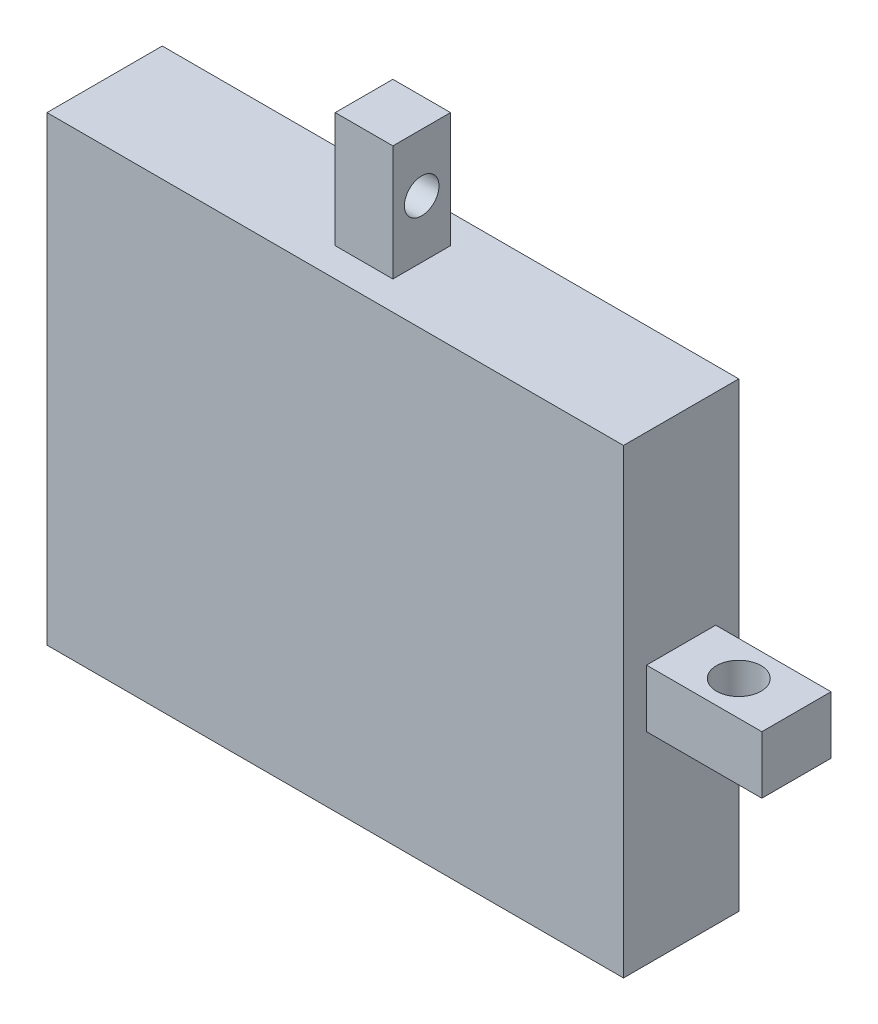
ISO-10303-21;
HEADER;
FILE_DESCRIPTION(('STEP AP214'),'2;1');
FILE_NAME('part.step','',(''),(''),'','','');
FILE_SCHEMA(('AUTOMOTIVE_DESIGN { 1 0 10303 214 1 1 1 1 }'));
ENDSEC;
DATA;
#1=APPLICATION_CONTEXT('core data for automotive mechanical design processes');
#2=APPLICATION_PROTOCOL_DEFINITION('international standard','automotive_design',2000,#1);
#3=PRODUCT_CONTEXT('',#1,'mechanical');
#4=PRODUCT('Part','Part','',(#3));
#5=PRODUCT_RELATED_PRODUCT_CATEGORY('part','',(#4));
#6=PRODUCT_DEFINITION_FORMATION('','',#4);
#7=PRODUCT_DEFINITION_CONTEXT('part definition',#1,'design');
#8=PRODUCT_DEFINITION('design','',#6,#7);
#9=PRODUCT_DEFINITION_SHAPE('','',#8);
#10=(LENGTH_UNIT() NAMED_UNIT(*) SI_UNIT(.MILLI.,.METRE.));
#11=(NAMED_UNIT(*) PLANE_ANGLE_UNIT() SI_UNIT($,.RADIAN.));
#12=(NAMED_UNIT(*) SI_UNIT($,.STERADIAN.) SOLID_ANGLE_UNIT());
#13=UNCERTAINTY_MEASURE_WITH_UNIT(LENGTH_MEASURE(1.E-05),#10,'distance_accuracy_value','');
#14=(GEOMETRIC_REPRESENTATION_CONTEXT(3) GLOBAL_UNCERTAINTY_ASSIGNED_CONTEXT((#13)) GLOBAL_UNIT_ASSIGNED_CONTEXT((#10,
#11,#12)) REPRESENTATION_CONTEXT('',''));
#15=CARTESIAN_POINT('',(0.,0.,0.));
#16=DIRECTION('',(0.,0.,1.));
#17=DIRECTION('',(1.,0.,0.));
#18=AXIS2_PLACEMENT_3D('',#15,#16,#17);
#19=CARTESIAN_POINT('',(-26.4685029579254,457.637931034483,10.));
#20=DIRECTION('',(0.,-1.,0.));
#21=DIRECTION('',(0.,0.,-1.));
#22=AXIS2_PLACEMENT_3D('',#19,#20,#21);
#23=PLANE('',#22);
#24=DIRECTION('',(-1.,0.,0.));
#25=VECTOR('',#24,1.);
#26=CARTESIAN_POINT('',(-26.4685029579254,457.637931034483,0.));
#27=LINE('',#26,#25);
#28=CARTESIAN_POINT('',(23.5314970420778,457.637931034483,0.));
#29=VERTEX_POINT('',#28);
#30=CARTESIAN_POINT('',(-26.4685029579285,457.637931034483,0.));
#31=VERTEX_POINT('',#30);
#32=EDGE_CURVE('E234',#29,#31,#27,.T.);
#33=ORIENTED_EDGE('',*,*,#32,.T.);
#34=DIRECTION('',(0.,0.,-1.));
#35=VECTOR('',#34,1.);
#36=CARTESIAN_POINT('',(-26.4685029579285,457.637931034483,10.));
#37=LINE('',#36,#35);
#38=CARTESIAN_POINT('',(-26.4685029579285,457.637931034483,10.));
#39=VERTEX_POINT('',#38);
#40=EDGE_CURVE('E173',#39,#31,#37,.T.);
#41=ORIENTED_EDGE('',*,*,#40,.F.);
#42=DIRECTION('',(-1.,0.,0.));
#43=VECTOR('',#42,1.);
#44=CARTESIAN_POINT('',(-26.4685029579254,457.637931034483,10.));
#45=LINE('',#44,#43);
#46=CARTESIAN_POINT('',(23.5314970420778,457.637931034483,10.));
#47=VERTEX_POINT('',#46);
#48=EDGE_CURVE('E237',#47,#39,#45,.T.);
#49=ORIENTED_EDGE('',*,*,#48,.F.);
#50=DIRECTION('',(0.,0.,-1.));
#51=VECTOR('',#50,1.);
#52=CARTESIAN_POINT('',(23.5314970420778,457.637931034483,10.));
#53=LINE('',#52,#51);
#54=EDGE_CURVE('E50',#47,#29,#53,.T.);
#55=ORIENTED_EDGE('',*,*,#54,.T.);
#56=EDGE_LOOP('',(#33,#41,#49,#55));
#57=FACE_BOUND('',#56,.T.);
#58=DIRECTION('',(0.,0.,1.));
#59=VECTOR('',#58,1.);
#60=CARTESIAN_POINT('',(-3.96850295792851,457.637931034483,2.5));
#61=LINE('',#60,#59);
#62=CARTESIAN_POINT('',(-3.96850295792851,457.637931034483,2.5));
#63=VERTEX_POINT('',#62);
#64=CARTESIAN_POINT('',(-3.96850295792851,457.637931034483,7.5));
#65=VERTEX_POINT('',#64);
#66=EDGE_CURVE('E153',#63,#65,#61,.T.);
#67=ORIENTED_EDGE('',*,*,#66,.F.);
#68=DIRECTION('',(-1.,0.,0.));
#69=VECTOR('',#68,1.);
#70=CARTESIAN_POINT('',(-3.96850295792851,457.637931034483,2.5));
#71=LINE('',#70,#69);
#72=CARTESIAN_POINT('',(1.0314970420778,457.637931034483,2.5));
#73=VERTEX_POINT('',#72);
#74=EDGE_CURVE('E150',#73,#63,#71,.T.);
#75=ORIENTED_EDGE('',*,*,#74,.F.);
#76=DIRECTION('',(0.,0.,-1.));
#77=VECTOR('',#76,1.);
#78=CARTESIAN_POINT('',(1.0314970420778,457.637931034483,2.5));
#79=LINE('',#78,#77);
#80=CARTESIAN_POINT('',(1.0314970420778,457.637931034483,7.5));
#81=VERTEX_POINT('',#80);
#82=EDGE_CURVE('E62',#81,#73,#79,.T.);
#83=ORIENTED_EDGE('',*,*,#82,.F.);
#84=DIRECTION('',(1.,0.,0.));
#85=VECTOR('',#84,1.);
#86=CARTESIAN_POINT('',(-3.96850295792851,457.637931034483,7.5));
#87=LINE('',#86,#85);
#88=EDGE_CURVE('E57',#65,#81,#87,.T.);
#89=ORIENTED_EDGE('',*,*,#88,.F.);
#90=EDGE_LOOP('',(#67,#75,#83,#89));
#91=FACE_BOUND('',#90,.T.);
#92=ADVANCED_FACE('F41',(#57,#91),#23,.F.);
#93=CARTESIAN_POINT('',(33.5314970420422,-2.60708386863427E-12,2.));
#94=DIRECTION('',(0.,0.,-1.));
#95=DIRECTION('',(-1.,0.,0.));
#96=AXIS2_PLACEMENT_3D('',#93,#94,#95);
#97=PLANE('',#96);
#98=DIRECTION('',(0.,-1.,0.));
#99=VECTOR('',#98,1.);
#100=CARTESIAN_POINT('',(23.5314970420422,-1.82992775139664E-12,2.));
#101=LINE('',#100,#99);
#102=CARTESIAN_POINT('',(23.5314970420747,440.137931034485,2.));
#103=VERTEX_POINT('',#102);
#104=CARTESIAN_POINT('',(23.5314970420747,435.137931034485,2.));
#105=VERTEX_POINT('',#104);
#106=EDGE_CURVE('E210',#103,#105,#101,.T.);
#107=ORIENTED_EDGE('',*,*,#106,.F.);
#108=DIRECTION('',(1.,0.,0.));
#109=VECTOR('',#108,1.);
#110=CARTESIAN_POINT('',(33.5314970420422,440.137931034485,2.));
#111=LINE('',#110,#109);
#112=CARTESIAN_POINT('',(33.5314970420768,440.137931034485,2.));
#113=VERTEX_POINT('',#112);
#114=EDGE_CURVE('E201',#103,#113,#111,.T.);
#115=ORIENTED_EDGE('',*,*,#114,.T.);
#116=DIRECTION('',(0.,-1.,0.));
#117=VECTOR('',#116,1.);
#118=CARTESIAN_POINT('',(33.5314970420422,-2.60708386863427E-12,2.));
#119=LINE('',#118,#117);
#120=CARTESIAN_POINT('',(33.5314970420757,435.137931034485,2.));
#121=VERTEX_POINT('',#120);
#122=EDGE_CURVE('E214',#113,#121,#119,.T.);
#123=ORIENTED_EDGE('',*,*,#122,.T.);
#124=DIRECTION('',(1.,0.,0.));
#125=VECTOR('',#124,1.);
#126=CARTESIAN_POINT('',(33.5314970420422,435.137931034485,2.));
#127=LINE('',#126,#125);
#128=EDGE_CURVE('E190',#105,#121,#127,.T.);
#129=ORIENTED_EDGE('',*,*,#128,.F.);
#130=EDGE_LOOP('',(#107,#115,#123,#129));
#131=FACE_BOUND('',#130,.T.);
#132=ADVANCED_FACE('F277',(#131),#97,.T.);
#133=CARTESIAN_POINT('',(33.5314970420422,-2.60708386863427E-12,8.));
#134=DIRECTION('',(0.,0.,-1.));
#135=DIRECTION('',(-1.,0.,0.));
#136=AXIS2_PLACEMENT_3D('',#133,#134,#135);
#137=PLANE('',#136);
#138=DIRECTION('',(-1.,0.,0.));
#139=VECTOR('',#138,1.);
#140=CARTESIAN_POINT('',(33.5314970420768,440.137931034485,8.));
#141=LINE('',#140,#139);
#142=CARTESIAN_POINT('',(33.5314970420764,440.137931034485,8.));
#143=VERTEX_POINT('',#142);
#144=CARTESIAN_POINT('',(23.5314970420747,440.137931034485,8.));
#145=VERTEX_POINT('',#144);
#146=EDGE_CURVE('E178',#143,#145,#141,.T.);
#147=ORIENTED_EDGE('',*,*,#146,.T.);
#148=DIRECTION('',(0.,-1.,0.));
#149=VECTOR('',#148,1.);
#150=CARTESIAN_POINT('',(23.5314970420422,-1.82992775139664E-12,8.));
#151=LINE('',#150,#149);
#152=CARTESIAN_POINT('',(23.5314970420747,435.137931034485,8.));
#153=VERTEX_POINT('',#152);
#154=EDGE_CURVE('E219',#145,#153,#151,.T.);
#155=ORIENTED_EDGE('',*,*,#154,.T.);
#156=DIRECTION('',(-1.,0.,0.));
#157=VECTOR('',#156,1.);
#158=CARTESIAN_POINT('',(33.5314970420757,435.137931034485,8.));
#159=LINE('',#158,#157);
#160=CARTESIAN_POINT('',(33.5314970420757,435.137931034485,8.));
#161=VERTEX_POINT('',#160);
#162=EDGE_CURVE('E183',#161,#153,#159,.T.);
#163=ORIENTED_EDGE('',*,*,#162,.F.);
#164=DIRECTION('',(0.,-1.,0.));
#165=VECTOR('',#164,1.);
#166=CARTESIAN_POINT('',(33.5314970420422,-2.60708386863427E-12,8.));
#167=LINE('',#166,#165);
#168=EDGE_CURVE('E218',#143,#161,#167,.T.);
#169=ORIENTED_EDGE('',*,*,#168,.F.);
#170=EDGE_LOOP('',(#147,#155,#163,#169));
#171=FACE_BOUND('',#170,.T.);
#172=ADVANCED_FACE('F284',(#171),#137,.F.);
#173=CARTESIAN_POINT('',(33.5314970420422,-2.60708386863427E-12,0.));
#174=DIRECTION('',(1.,0.,0.));
#175=DIRECTION('',(0.,1.,0.));
#176=AXIS2_PLACEMENT_3D('',#173,#174,#175);
#177=PLANE('',#176);
#178=ORIENTED_EDGE('',*,*,#122,.F.);
#179=DIRECTION('',(0.,0.,1.));
#180=VECTOR('',#179,1.);
#181=CARTESIAN_POINT('',(33.5314970420768,440.137931034485,-7.));
#182=LINE('',#181,#180);
#183=EDGE_CURVE('E182',#113,#143,#182,.T.);
#184=ORIENTED_EDGE('',*,*,#183,.T.);
#185=ORIENTED_EDGE('',*,*,#168,.T.);
#186=DIRECTION('',(0.,0.,1.));
#187=VECTOR('',#186,1.);
#188=CARTESIAN_POINT('',(33.5314970420757,435.137931034485,-7.));
#189=LINE('',#188,#187);
#190=EDGE_CURVE('E177',#121,#161,#189,.T.);
#191=ORIENTED_EDGE('',*,*,#190,.F.);
#192=EDGE_LOOP('',(#178,#184,#185,#191));
#193=FACE_BOUND('',#192,.T.);
#194=ADVANCED_FACE('F275',(#193),#177,.T.);
#195=CARTESIAN_POINT('',(23.5314970420778,457.637931034483,10.));
#196=DIRECTION('',(-1.,0.,0.));
#197=DIRECTION('',(0.,-1.,0.));
#198=AXIS2_PLACEMENT_3D('',#195,#196,#197);
#199=PLANE('',#198);
#200=DIRECTION('',(0.,1.,0.));
#201=VECTOR('',#200,1.);
#202=CARTESIAN_POINT('',(23.5314970420778,457.637931034483,0.));
#203=LINE('',#202,#201);
#204=CARTESIAN_POINT('',(23.5314970420747,417.637931034484,0.));
#205=VERTEX_POINT('',#204);
#206=EDGE_CURVE('E242',#205,#29,#203,.T.);
#207=ORIENTED_EDGE('',*,*,#206,.T.);
#208=ORIENTED_EDGE('',*,*,#54,.F.);
#209=DIRECTION('',(0.,1.,0.));
#210=VECTOR('',#209,1.);
#211=CARTESIAN_POINT('',(23.5314970420778,457.637931034483,10.));
#212=LINE('',#211,#210);
#213=CARTESIAN_POINT('',(23.5314970420747,417.637931034484,10.));
#214=VERTEX_POINT('',#213);
#215=EDGE_CURVE('E233',#214,#47,#212,.T.);
#216=ORIENTED_EDGE('',*,*,#215,.F.);
#217=DIRECTION('',(0.,0.,-1.));
#218=VECTOR('',#217,1.);
#219=CARTESIAN_POINT('',(23.5314970420747,417.637931034484,10.));
#220=LINE('',#219,#218);
#221=EDGE_CURVE('E11',#214,#205,#220,.T.);
#222=ORIENTED_EDGE('',*,*,#221,.T.);
#223=EDGE_LOOP('',(#207,#208,#216,#222));
#224=FACE_BOUND('',#223,.T.);
#225=DIRECTION('',(0.,0.,1.));
#226=VECTOR('',#225,1.);
#227=CARTESIAN_POINT('',(23.5314970420747,440.137931034485,-7.));
#228=LINE('',#227,#226);
#229=EDGE_CURVE('E187',#103,#145,#228,.T.);
#230=ORIENTED_EDGE('',*,*,#229,.F.);
#231=ORIENTED_EDGE('',*,*,#106,.T.);
#232=DIRECTION('',(0.,0.,1.));
#233=VECTOR('',#232,1.);
#234=CARTESIAN_POINT('',(23.5314970420747,435.137931034485,-7.));
#235=LINE('',#234,#233);
#236=EDGE_CURVE('E191',#105,#153,#235,.T.);
#237=ORIENTED_EDGE('',*,*,#236,.T.);
#238=ORIENTED_EDGE('',*,*,#154,.F.);
#239=EDGE_LOOP('',(#230,#231,#237,#238));
#240=FACE_BOUND('',#239,.T.);
#241=ADVANCED_FACE('F266',(#224,#240),#199,.F.);
#242=CARTESIAN_POINT('',(-26.4685029579254,417.637931034484,10.));
#243=DIRECTION('',(0.,1.,0.));
#244=DIRECTION('',(0.,0.,1.));
#245=AXIS2_PLACEMENT_3D('',#242,#243,#244);
#246=PLANE('',#245);
#247=DIRECTION('',(1.,0.,0.));
#248=VECTOR('',#247,1.);
#249=CARTESIAN_POINT('',(-26.4685029579254,417.637931034484,10.));
#250=LINE('',#249,#248);
#251=CARTESIAN_POINT('',(-26.4685029579254,417.637931034484,10.));
#252=VERTEX_POINT('',#251);
#253=EDGE_CURVE('E230',#252,#214,#250,.T.);
#254=ORIENTED_EDGE('',*,*,#253,.F.);
#255=DIRECTION('',(0.,0.,-1.));
#256=VECTOR('',#255,1.);
#257=CARTESIAN_POINT('',(-26.4685029579254,417.637931034484,10.));
#258=LINE('',#257,#256);
#259=CARTESIAN_POINT('',(-26.4685029579254,417.637931034484,0.));
#260=VERTEX_POINT('',#259);
#261=EDGE_CURVE('E168',#252,#260,#258,.T.);
#262=ORIENTED_EDGE('',*,*,#261,.T.);
#263=DIRECTION('',(1.,0.,0.));
#264=VECTOR('',#263,1.);
#265=CARTESIAN_POINT('',(-26.4685029579254,417.637931034484,0.));
#266=LINE('',#265,#264);
#267=EDGE_CURVE('E223',#260,#205,#266,.T.);
#268=ORIENTED_EDGE('',*,*,#267,.T.);
#269=ORIENTED_EDGE('',*,*,#221,.F.);
#270=EDGE_LOOP('',(#254,#262,#268,#269));
#271=FACE_BOUND('',#270,.T.);
#272=ADVANCED_FACE('F43',(#271),#246,.F.);
#273=CARTESIAN_POINT('',(0.,0.,10.));
#274=DIRECTION('',(0.,0.,1.));
#275=DIRECTION('',(1.,0.,0.));
#276=AXIS2_PLACEMENT_3D('',#273,#274,#275);
#277=PLANE('',#276);
#278=ORIENTED_EDGE('',*,*,#48,.T.);
#279=DIRECTION('',(0.,1.,0.));
#280=VECTOR('',#279,1.);
#281=CARTESIAN_POINT('',(-26.4685029579285,457.637931034483,10.));
#282=LINE('',#281,#280);
#283=EDGE_CURVE('E160',#252,#39,#282,.T.);
#284=ORIENTED_EDGE('',*,*,#283,.F.);
#285=ORIENTED_EDGE('',*,*,#253,.T.);
#286=ORIENTED_EDGE('',*,*,#215,.T.);
#287=EDGE_LOOP('',(#278,#284,#285,#286));
#288=FACE_BOUND('',#287,.T.);
#289=ADVANCED_FACE('F264',(#288),#277,.T.);
#290=CARTESIAN_POINT('',(0.,0.,0.));
#291=DIRECTION('',(0.,0.,1.));
#292=DIRECTION('',(1.,0.,0.));
#293=AXIS2_PLACEMENT_3D('',#290,#291,#292);
#294=PLANE('',#293);
#295=ORIENTED_EDGE('',*,*,#267,.F.);
#296=DIRECTION('',(0.,1.,0.));
#297=VECTOR('',#296,1.);
#298=CARTESIAN_POINT('',(-26.4685029579285,457.637931034483,0.));
#299=LINE('',#298,#297);
#300=EDGE_CURVE('E155',#260,#31,#299,.T.);
#301=ORIENTED_EDGE('',*,*,#300,.T.);
#302=ORIENTED_EDGE('',*,*,#32,.F.);
#303=ORIENTED_EDGE('',*,*,#206,.F.);
#304=EDGE_LOOP('',(#295,#301,#302,#303));
#305=FACE_BOUND('',#304,.T.);
#306=ADVANCED_FACE('F257',(#305),#294,.F.);
#307=CARTESIAN_POINT('',(3.38170104945569E-11,435.137931034487,0.));
#308=DIRECTION('',(0.,-1.,0.));
#309=DIRECTION('',(1.,0.,0.));
#310=AXIS2_PLACEMENT_3D('',#307,#308,#309);
#311=PLANE('',#310);
#312=CARTESIAN_POINT('',(28.531497042076,435.137931034485,5.00000000000001));
#313=DIRECTION('',(0.,1.,0.));
#314=DIRECTION('',(-1.,0.,0.));
#315=AXIS2_PLACEMENT_3D('',#312,#313,#314);
#316=CIRCLE('',#315,1.93089717066683);
#317=CARTESIAN_POINT('',(26.6005998714092,435.137931034485,5.00000000000001));
#318=VERTEX_POINT('',#317);
#319=EDGE_CURVE('E205',#318,#318,#316,.T.);
#320=ORIENTED_EDGE('',*,*,#319,.T.);
#321=EDGE_LOOP('',(#320));
#322=FACE_BOUND('',#321,.T.);
#323=ORIENTED_EDGE('',*,*,#128,.T.);
#324=ORIENTED_EDGE('',*,*,#190,.T.);
#325=ORIENTED_EDGE('',*,*,#162,.T.);
#326=ORIENTED_EDGE('',*,*,#236,.F.);
#327=EDGE_LOOP('',(#323,#324,#325,#326));
#328=FACE_BOUND('',#327,.T.);
#329=ADVANCED_FACE('F289',(#322,#328),#311,.T.);
#330=CARTESIAN_POINT('',(28.5314970420764,440.137931034485,5.00000000000001));
#331=DIRECTION('',(0.,-1.,0.));
#332=DIRECTION('',(1.,0.,0.));
#333=AXIS2_PLACEMENT_3D('',#330,#331,#332);
#334=CYLINDRICAL_SURFACE('',#333,1.93089717066683);
#335=CARTESIAN_POINT('',(28.5314970420764,440.137931034485,5.00000000000001));
#336=DIRECTION('',(0.,1.,0.));
#337=DIRECTION('',(-1.,0.,0.));
#338=AXIS2_PLACEMENT_3D('',#335,#336,#337);
#339=CIRCLE('',#338,1.93089717066683);
#340=CARTESIAN_POINT('',(26.6005998714096,440.137931034485,5.00000000000001));
#341=VERTEX_POINT('',#340);
#342=EDGE_CURVE('E206',#341,#341,#339,.T.);
#343=ORIENTED_EDGE('',*,*,#342,.T.);
#344=EDGE_LOOP('',(#343));
#345=FACE_BOUND('',#344,.T.);
#346=ORIENTED_EDGE('',*,*,#319,.F.);
#347=EDGE_LOOP('',(#346));
#348=FACE_BOUND('',#347,.T.);
#349=ADVANCED_FACE('F299',(#345,#348),#334,.F.);
#350=CARTESIAN_POINT('',(3.42055885531757E-11,440.137931034487,0.));
#351=DIRECTION('',(0.,-1.,0.));
#352=DIRECTION('',(1.,0.,0.));
#353=AXIS2_PLACEMENT_3D('',#350,#351,#352);
#354=PLANE('',#353);
#355=ORIENTED_EDGE('',*,*,#342,.F.);
#356=EDGE_LOOP('',(#355));
#357=FACE_BOUND('',#356,.T.);
#358=ORIENTED_EDGE('',*,*,#229,.T.);
#359=ORIENTED_EDGE('',*,*,#146,.F.);
#360=ORIENTED_EDGE('',*,*,#183,.F.);
#361=ORIENTED_EDGE('',*,*,#114,.F.);
#362=EDGE_LOOP('',(#358,#359,#360,#361));
#363=FACE_BOUND('',#362,.T.);
#364=ADVANCED_FACE('F301',(#357,#363),#354,.F.);
#365=CARTESIAN_POINT('',(-26.4685029579285,457.637931034483,10.));
#366=DIRECTION('',(-1.,0.,0.));
#367=DIRECTION('',(0.,-1.,0.));
#368=AXIS2_PLACEMENT_3D('',#365,#366,#367);
#369=PLANE('',#368);
#370=ORIENTED_EDGE('',*,*,#300,.F.);
#371=ORIENTED_EDGE('',*,*,#261,.F.);
#372=ORIENTED_EDGE('',*,*,#283,.T.);
#373=ORIENTED_EDGE('',*,*,#40,.T.);
#374=EDGE_LOOP('',(#370,#371,#372,#373));
#375=FACE_BOUND('',#374,.T.);
#376=ADVANCED_FACE('F261',(#375),#369,.T.);
#377=CARTESIAN_POINT('',(-3.96850295792851,467.637931034483,2.5));
#378=DIRECTION('',(1.,0.,0.));
#379=DIRECTION('',(0.,0.,-1.));
#380=AXIS2_PLACEMENT_3D('',#377,#378,#379);
#381=PLANE('',#380);
#382=CARTESIAN_POINT('',(-3.96850295792851,462.637931034483,5.));
#383=DIRECTION('',(1.,0.,0.));
#384=DIRECTION('',(0.,0.,-1.));
#385=AXIS2_PLACEMENT_3D('',#382,#383,#384);
#386=CIRCLE('',#385,1.5);
#387=CARTESIAN_POINT('',(-3.96850295792851,462.637931034483,3.5));
#388=VERTEX_POINT('',#387);
#389=EDGE_CURVE('E336',#388,#388,#386,.T.);
#390=ORIENTED_EDGE('',*,*,#389,.T.);
#391=EDGE_LOOP('',(#390));
#392=FACE_BOUND('',#391,.T.);
#393=ORIENTED_EDGE('',*,*,#66,.T.);
#394=DIRECTION('',(0.,-1.,0.));
#395=VECTOR('',#394,1.);
#396=CARTESIAN_POINT('',(-3.96850295792851,467.637931034483,7.5));
#397=LINE('',#396,#395);
#398=CARTESIAN_POINT('',(-3.96850295792851,467.637931034483,7.5));
#399=VERTEX_POINT('',#398);
#400=EDGE_CURVE('E132',#399,#65,#397,.T.);
#401=ORIENTED_EDGE('',*,*,#400,.F.);
#402=DIRECTION('',(0.,0.,1.));
#403=VECTOR('',#402,1.);
#404=CARTESIAN_POINT('',(-3.96850295792851,467.637931034483,2.5));
#405=LINE('',#404,#403);
#406=CARTESIAN_POINT('',(-3.96850295792851,467.637931034483,2.5));
#407=VERTEX_POINT('',#406);
#408=EDGE_CURVE('E140',#407,#399,#405,.T.);
#409=ORIENTED_EDGE('',*,*,#408,.F.);
#410=DIRECTION('',(0.,-1.,0.));
#411=VECTOR('',#410,1.);
#412=CARTESIAN_POINT('',(-3.96850295792851,467.637931034483,2.5));
#413=LINE('',#412,#411);
#414=EDGE_CURVE('E347',#407,#63,#413,.T.);
#415=ORIENTED_EDGE('',*,*,#414,.T.);
#416=EDGE_LOOP('',(#393,#401,#409,#415));
#417=FACE_BOUND('',#416,.T.);
#418=ADVANCED_FACE('F152',(#392,#417),#381,.F.);
#419=CARTESIAN_POINT('',(-3.96850295792851,467.637931034483,7.5));
#420=DIRECTION('',(0.,0.,-1.));
#421=DIRECTION('',(-1.,0.,0.));
#422=AXIS2_PLACEMENT_3D('',#419,#420,#421);
#423=PLANE('',#422);
#424=ORIENTED_EDGE('',*,*,#88,.T.);
#425=DIRECTION('',(0.,-1.,0.));
#426=VECTOR('',#425,1.);
#427=CARTESIAN_POINT('',(1.0314970420778,467.637931034483,7.5));
#428=LINE('',#427,#426);
#429=CARTESIAN_POINT('',(1.0314970420778,467.637931034483,7.5));
#430=VERTEX_POINT('',#429);
#431=EDGE_CURVE('E135',#430,#81,#428,.T.);
#432=ORIENTED_EDGE('',*,*,#431,.F.);
#433=DIRECTION('',(1.,0.,0.));
#434=VECTOR('',#433,1.);
#435=CARTESIAN_POINT('',(-3.96850295792851,467.637931034483,7.5));
#436=LINE('',#435,#434);
#437=EDGE_CURVE('E128',#399,#430,#436,.T.);
#438=ORIENTED_EDGE('',*,*,#437,.F.);
#439=ORIENTED_EDGE('',*,*,#400,.T.);
#440=EDGE_LOOP('',(#424,#432,#438,#439));
#441=FACE_BOUND('',#440,.T.);
#442=ADVANCED_FACE('F130',(#441),#423,.F.);
#443=CARTESIAN_POINT('',(1.0314970420778,467.637931034483,2.5));
#444=DIRECTION('',(-1.,0.,0.));
#445=DIRECTION('',(0.,0.,1.));
#446=AXIS2_PLACEMENT_3D('',#443,#444,#445);
#447=PLANE('',#446);
#448=CARTESIAN_POINT('',(1.0314970420778,462.637931034483,5.));
#449=DIRECTION('',(1.,0.,0.));
#450=DIRECTION('',(0.,0.,-1.));
#451=AXIS2_PLACEMENT_3D('',#448,#449,#450);
#452=CIRCLE('',#451,1.5);
#453=CARTESIAN_POINT('',(1.0314970420778,462.637931034483,3.5));
#454=VERTEX_POINT('',#453);
#455=EDGE_CURVE('E333',#454,#454,#452,.T.);
#456=ORIENTED_EDGE('',*,*,#455,.F.);
#457=EDGE_LOOP('',(#456));
#458=FACE_BOUND('',#457,.T.);
#459=ORIENTED_EDGE('',*,*,#82,.T.);
#460=DIRECTION('',(0.,-1.,0.));
#461=VECTOR('',#460,1.);
#462=CARTESIAN_POINT('',(1.0314970420778,467.637931034483,2.5));
#463=LINE('',#462,#461);
#464=CARTESIAN_POINT('',(1.0314970420778,467.637931034483,2.5));
#465=VERTEX_POINT('',#464);
#466=EDGE_CURVE('E162',#465,#73,#463,.T.);
#467=ORIENTED_EDGE('',*,*,#466,.F.);
#468=DIRECTION('',(0.,0.,-1.));
#469=VECTOR('',#468,1.);
#470=CARTESIAN_POINT('',(1.0314970420778,467.637931034483,2.5));
#471=LINE('',#470,#469);
#472=EDGE_CURVE('E139',#430,#465,#471,.T.);
#473=ORIENTED_EDGE('',*,*,#472,.F.);
#474=ORIENTED_EDGE('',*,*,#431,.T.);
#475=EDGE_LOOP('',(#459,#467,#473,#474));
#476=FACE_BOUND('',#475,.T.);
#477=ADVANCED_FACE('F315',(#458,#476),#447,.F.);
#478=CARTESIAN_POINT('',(-3.96850295792851,467.637931034483,2.5));
#479=DIRECTION('',(0.,0.,1.));
#480=DIRECTION('',(1.,0.,0.));
#481=AXIS2_PLACEMENT_3D('',#478,#479,#480);
#482=PLANE('',#481);
#483=ORIENTED_EDGE('',*,*,#74,.T.);
#484=ORIENTED_EDGE('',*,*,#414,.F.);
#485=DIRECTION('',(-1.,0.,0.));
#486=VECTOR('',#485,1.);
#487=CARTESIAN_POINT('',(-3.96850295792851,467.637931034483,2.5));
#488=LINE('',#487,#486);
#489=EDGE_CURVE('E145',#465,#407,#488,.T.);
#490=ORIENTED_EDGE('',*,*,#489,.F.);
#491=ORIENTED_EDGE('',*,*,#466,.T.);
#492=EDGE_LOOP('',(#483,#484,#490,#491));
#493=FACE_BOUND('',#492,.T.);
#494=ADVANCED_FACE('F318',(#493),#482,.F.);
#495=CARTESIAN_POINT('',(0.,467.637931034483,0.));
#496=DIRECTION('',(0.,1.,0.));
#497=DIRECTION('',(0.,0.,1.));
#498=AXIS2_PLACEMENT_3D('',#495,#496,#497);
#499=PLANE('',#498);
#500=ORIENTED_EDGE('',*,*,#408,.T.);
#501=ORIENTED_EDGE('',*,*,#437,.T.);
#502=ORIENTED_EDGE('',*,*,#472,.T.);
#503=ORIENTED_EDGE('',*,*,#489,.T.);
#504=EDGE_LOOP('',(#500,#501,#502,#503));
#505=FACE_BOUND('',#504,.T.);
#506=ADVANCED_FACE('F143',(#505),#499,.T.);
#507=CARTESIAN_POINT('',(-8.9685029579222,462.637931034483,5.));
#508=DIRECTION('',(1.,0.,0.));
#509=DIRECTION('',(0.,0.,-1.));
#510=AXIS2_PLACEMENT_3D('',#507,#508,#509);
#511=CYLINDRICAL_SURFACE('',#510,1.5);
#512=ORIENTED_EDGE('',*,*,#455,.T.);
#513=EDGE_LOOP('',(#512));
#514=FACE_BOUND('',#513,.T.);
#515=ORIENTED_EDGE('',*,*,#389,.F.);
#516=EDGE_LOOP('',(#515));
#517=FACE_BOUND('',#516,.T.);
#518=ADVANCED_FACE('F325',(#514,#517),#511,.F.);
#519=CLOSED_SHELL('',(#92,#132,#172,#194,#241,#272,#289,#306,#329,#349,#364,#376,#418,#442,#477,
#494,#506,#518));
#520=MANIFOLD_SOLID_BREP('B2',#519);
#521=ADVANCED_BREP_SHAPE_REPRESENTATION('',(#18,#520),#14);
#522=SHAPE_DEFINITION_REPRESENTATION(#9,#521);
ENDSEC;
END-ISO-10303-21;
